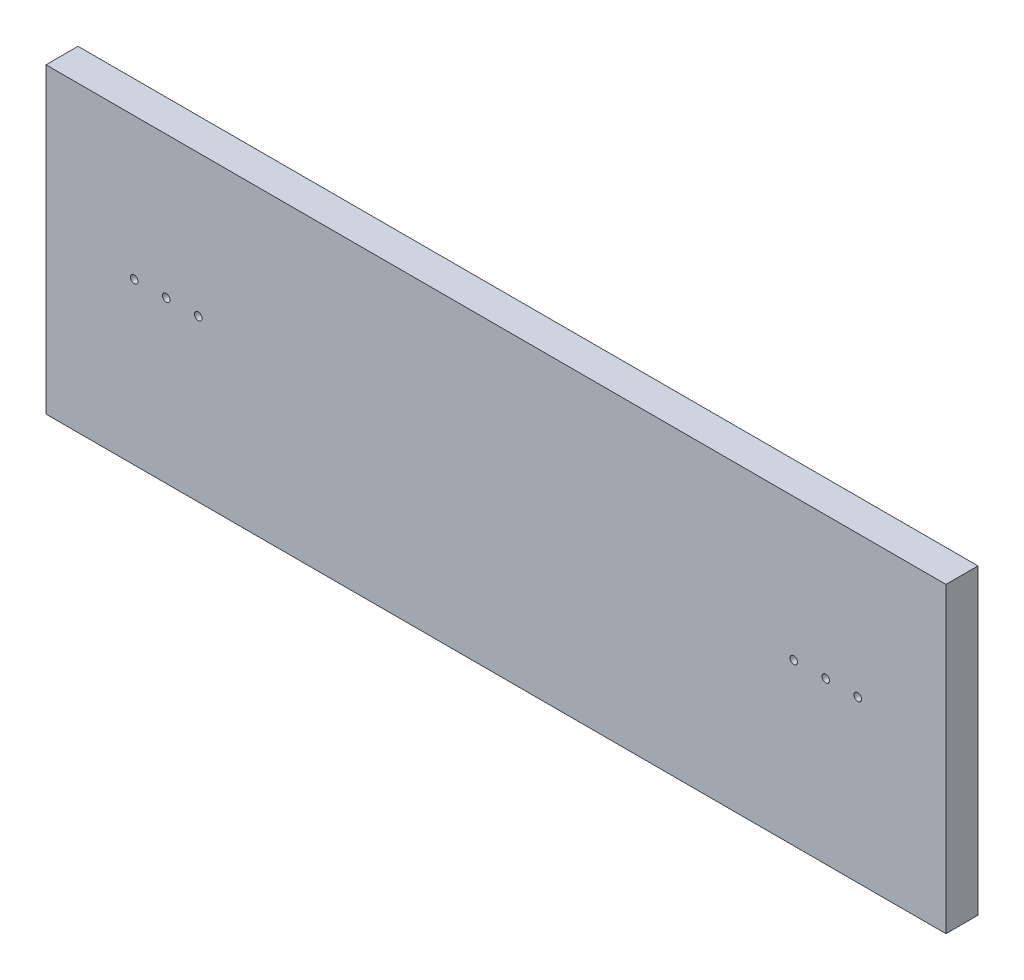
ISO-10303-21;
HEADER;
FILE_DESCRIPTION(('STEP AP214'),'2;1');
FILE_NAME('part.step','',(''),(''),'','','');
FILE_SCHEMA(('AUTOMOTIVE_DESIGN { 1 0 10303 214 1 1 1 1 }'));
ENDSEC;
DATA;
#1=APPLICATION_CONTEXT('core data for automotive mechanical design processes');
#2=APPLICATION_PROTOCOL_DEFINITION('international standard','automotive_design',2000,#1);
#3=PRODUCT_CONTEXT('',#1,'mechanical');
#4=PRODUCT('Part','Part','',(#3));
#5=PRODUCT_RELATED_PRODUCT_CATEGORY('part','',(#4));
#6=PRODUCT_DEFINITION_FORMATION('','',#4);
#7=PRODUCT_DEFINITION_CONTEXT('part definition',#1,'design');
#8=PRODUCT_DEFINITION('design','',#6,#7);
#9=PRODUCT_DEFINITION_SHAPE('','',#8);
#10=(LENGTH_UNIT() NAMED_UNIT(*) SI_UNIT(.MILLI.,.METRE.));
#11=(NAMED_UNIT(*) PLANE_ANGLE_UNIT() SI_UNIT($,.RADIAN.));
#12=(NAMED_UNIT(*) SI_UNIT($,.STERADIAN.) SOLID_ANGLE_UNIT());
#13=UNCERTAINTY_MEASURE_WITH_UNIT(LENGTH_MEASURE(1.E-05),#10,'distance_accuracy_value','');
#14=(GEOMETRIC_REPRESENTATION_CONTEXT(3) GLOBAL_UNCERTAINTY_ASSIGNED_CONTEXT((#13)) GLOBAL_UNIT_ASSIGNED_CONTEXT((#10,
#11,#12)) REPRESENTATION_CONTEXT('',''));
#15=CARTESIAN_POINT('',(0.,0.,0.));
#16=DIRECTION('',(0.,0.,1.));
#17=DIRECTION('',(1.,0.,0.));
#18=AXIS2_PLACEMENT_3D('',#15,#16,#17);
#19=CARTESIAN_POINT('',(178.5,60.,12.7));
#20=DIRECTION('',(-1.,0.,0.));
#21=DIRECTION('',(0.,0.,1.));
#22=AXIS2_PLACEMENT_3D('',#19,#20,#21);
#23=PLANE('',#22);
#24=DIRECTION('',(0.,1.,0.));
#25=VECTOR('',#24,1.);
#26=CARTESIAN_POINT('',(178.5,60.,0.));
#27=LINE('',#26,#25);
#28=CARTESIAN_POINT('',(178.5,-60.,0.));
#29=VERTEX_POINT('',#28);
#30=CARTESIAN_POINT('',(178.5,60.,0.));
#31=VERTEX_POINT('',#30);
#32=EDGE_CURVE('E106',#29,#31,#27,.T.);
#33=ORIENTED_EDGE('',*,*,#32,.T.);
#34=DIRECTION('',(0.,0.,-1.));
#35=VECTOR('',#34,1.);
#36=CARTESIAN_POINT('',(178.5,60.,12.7));
#37=LINE('',#36,#35);
#38=CARTESIAN_POINT('',(178.5,60.,12.7));
#39=VERTEX_POINT('',#38);
#40=EDGE_CURVE('E11',#39,#31,#37,.T.);
#41=ORIENTED_EDGE('',*,*,#40,.F.);
#42=DIRECTION('',(0.,1.,0.));
#43=VECTOR('',#42,1.);
#44=CARTESIAN_POINT('',(178.5,60.,12.7));
#45=LINE('',#44,#43);
#46=CARTESIAN_POINT('',(178.5,-60.,12.7));
#47=VERTEX_POINT('',#46);
#48=EDGE_CURVE('E94',#47,#39,#45,.T.);
#49=ORIENTED_EDGE('',*,*,#48,.F.);
#50=DIRECTION('',(0.,0.,-1.));
#51=VECTOR('',#50,1.);
#52=CARTESIAN_POINT('',(178.5,-60.,12.7));
#53=LINE('',#52,#51);
#54=EDGE_CURVE('E102',#47,#29,#53,.T.);
#55=ORIENTED_EDGE('',*,*,#54,.T.);
#56=EDGE_LOOP('',(#33,#41,#49,#55));
#57=FACE_BOUND('',#56,.T.);
#58=ADVANCED_FACE('F43',(#57),#23,.F.);
#59=CARTESIAN_POINT('',(-178.5,60.,12.7));
#60=DIRECTION('',(0.,-1.,0.));
#61=DIRECTION('',(0.,0.,-1.));
#62=AXIS2_PLACEMENT_3D('',#59,#60,#61);
#63=PLANE('',#62);
#64=DIRECTION('',(-1.,0.,0.));
#65=VECTOR('',#64,1.);
#66=CARTESIAN_POINT('',(-178.5,60.,0.));
#67=LINE('',#66,#65);
#68=CARTESIAN_POINT('',(-178.5,60.,0.));
#69=VERTEX_POINT('',#68);
#70=EDGE_CURVE('E98',#31,#69,#67,.T.);
#71=ORIENTED_EDGE('',*,*,#70,.T.);
#72=DIRECTION('',(0.,0.,-1.));
#73=VECTOR('',#72,1.);
#74=CARTESIAN_POINT('',(-178.5,60.,12.7));
#75=LINE('',#74,#73);
#76=CARTESIAN_POINT('',(-178.5,60.,12.7));
#77=VERTEX_POINT('',#76);
#78=EDGE_CURVE('E51',#77,#69,#75,.T.);
#79=ORIENTED_EDGE('',*,*,#78,.F.);
#80=DIRECTION('',(-1.,0.,0.));
#81=VECTOR('',#80,1.);
#82=CARTESIAN_POINT('',(-178.5,60.,12.7));
#83=LINE('',#82,#81);
#84=EDGE_CURVE('E89',#39,#77,#83,.T.);
#85=ORIENTED_EDGE('',*,*,#84,.F.);
#86=ORIENTED_EDGE('',*,*,#40,.T.);
#87=EDGE_LOOP('',(#71,#79,#85,#86));
#88=FACE_BOUND('',#87,.T.);
#89=ADVANCED_FACE('F97',(#88),#63,.F.);
#90=CARTESIAN_POINT('',(-178.5,60.,12.7));
#91=DIRECTION('',(1.,0.,0.));
#92=DIRECTION('',(0.,0.,-1.));
#93=AXIS2_PLACEMENT_3D('',#90,#91,#92);
#94=PLANE('',#93);
#95=DIRECTION('',(0.,-1.,0.));
#96=VECTOR('',#95,1.);
#97=CARTESIAN_POINT('',(-178.5,60.,0.));
#98=LINE('',#97,#96);
#99=CARTESIAN_POINT('',(-178.5,-60.,0.));
#100=VERTEX_POINT('',#99);
#101=EDGE_CURVE('E76',#69,#100,#98,.T.);
#102=ORIENTED_EDGE('',*,*,#101,.T.);
#103=DIRECTION('',(0.,0.,-1.));
#104=VECTOR('',#103,1.);
#105=CARTESIAN_POINT('',(-178.5,-60.,12.7));
#106=LINE('',#105,#104);
#107=CARTESIAN_POINT('',(-178.5,-60.,12.7));
#108=VERTEX_POINT('',#107);
#109=EDGE_CURVE('E99',#108,#100,#106,.T.);
#110=ORIENTED_EDGE('',*,*,#109,.F.);
#111=DIRECTION('',(0.,-1.,0.));
#112=VECTOR('',#111,1.);
#113=CARTESIAN_POINT('',(-178.5,60.,12.7));
#114=LINE('',#113,#112);
#115=EDGE_CURVE('E92',#77,#108,#114,.T.);
#116=ORIENTED_EDGE('',*,*,#115,.F.);
#117=ORIENTED_EDGE('',*,*,#78,.T.);
#118=EDGE_LOOP('',(#102,#110,#116,#117));
#119=FACE_BOUND('',#118,.T.);
#120=ADVANCED_FACE('F100',(#119),#94,.F.);
#121=CARTESIAN_POINT('',(-178.5,-60.,12.7));
#122=DIRECTION('',(0.,1.,0.));
#123=DIRECTION('',(0.,0.,1.));
#124=AXIS2_PLACEMENT_3D('',#121,#122,#123);
#125=PLANE('',#124);
#126=DIRECTION('',(1.,0.,0.));
#127=VECTOR('',#126,1.);
#128=CARTESIAN_POINT('',(-178.5,-60.,0.));
#129=LINE('',#128,#127);
#130=EDGE_CURVE('E82',#100,#29,#129,.T.);
#131=ORIENTED_EDGE('',*,*,#130,.T.);
#132=ORIENTED_EDGE('',*,*,#54,.F.);
#133=DIRECTION('',(1.,0.,0.));
#134=VECTOR('',#133,1.);
#135=CARTESIAN_POINT('',(-178.5,-60.,12.7));
#136=LINE('',#135,#134);
#137=EDGE_CURVE('E59',#108,#47,#136,.T.);
#138=ORIENTED_EDGE('',*,*,#137,.F.);
#139=ORIENTED_EDGE('',*,*,#109,.T.);
#140=EDGE_LOOP('',(#131,#132,#138,#139));
#141=FACE_BOUND('',#140,.T.);
#142=ADVANCED_FACE('F114',(#141),#125,.F.);
#143=CARTESIAN_POINT('',(0.,0.,12.7));
#144=DIRECTION('',(0.,0.,1.));
#145=DIRECTION('',(1.,0.,0.));
#146=AXIS2_PLACEMENT_3D('',#143,#144,#145);
#147=PLANE('',#146);
#148=CARTESIAN_POINT('',(143.5,3.80000000000007,12.7));
#149=DIRECTION('',(0.,0.,1.));
#150=DIRECTION('',(1.,0.,0.));
#151=AXIS2_PLACEMENT_3D('',#148,#149,#150);
#152=CIRCLE('',#151,1.5);
#153=CARTESIAN_POINT('',(145.,3.80000000000007,12.7));
#154=VERTEX_POINT('',#153);
#155=EDGE_CURVE('E150',#154,#154,#152,.T.);
#156=ORIENTED_EDGE('',*,*,#155,.F.);
#157=EDGE_LOOP('',(#156));
#158=FACE_BOUND('',#157,.T.);
#159=CARTESIAN_POINT('',(130.8,3.80000000000007,12.7));
#160=DIRECTION('',(0.,0.,1.));
#161=DIRECTION('',(1.,0.,0.));
#162=AXIS2_PLACEMENT_3D('',#159,#160,#161);
#163=CIRCLE('',#162,1.5);
#164=CARTESIAN_POINT('',(132.3,3.80000000000007,12.7));
#165=VERTEX_POINT('',#164);
#166=EDGE_CURVE('E147',#165,#165,#163,.T.);
#167=ORIENTED_EDGE('',*,*,#166,.F.);
#168=EDGE_LOOP('',(#167));
#169=FACE_BOUND('',#168,.T.);
#170=CARTESIAN_POINT('',(118.1,3.80000000000007,12.7));
#171=DIRECTION('',(0.,0.,1.));
#172=DIRECTION('',(1.,0.,0.));
#173=AXIS2_PLACEMENT_3D('',#170,#171,#172);
#174=CIRCLE('',#173,1.5);
#175=CARTESIAN_POINT('',(119.6,3.80000000000007,12.7));
#176=VERTEX_POINT('',#175);
#177=EDGE_CURVE('E141',#176,#176,#174,.T.);
#178=ORIENTED_EDGE('',*,*,#177,.F.);
#179=EDGE_LOOP('',(#178));
#180=FACE_BOUND('',#179,.T.);
#181=CARTESIAN_POINT('',(-118.1,3.80000000000004,12.7));
#182=DIRECTION('',(0.,0.,1.));
#183=DIRECTION('',(-1.,0.,0.));
#184=AXIS2_PLACEMENT_3D('',#181,#182,#183);
#185=CIRCLE('',#184,1.5);
#186=CARTESIAN_POINT('',(-119.6,3.80000000000004,12.7));
#187=VERTEX_POINT('',#186);
#188=EDGE_CURVE('E135',#187,#187,#185,.T.);
#189=ORIENTED_EDGE('',*,*,#188,.F.);
#190=EDGE_LOOP('',(#189));
#191=FACE_BOUND('',#190,.T.);
#192=CARTESIAN_POINT('',(-130.8,3.80000000000004,12.7));
#193=DIRECTION('',(0.,0.,1.));
#194=DIRECTION('',(-1.,0.,0.));
#195=AXIS2_PLACEMENT_3D('',#192,#193,#194);
#196=CIRCLE('',#195,1.5);
#197=CARTESIAN_POINT('',(-132.3,3.80000000000004,12.7));
#198=VERTEX_POINT('',#197);
#199=EDGE_CURVE('E129',#198,#198,#196,.T.);
#200=ORIENTED_EDGE('',*,*,#199,.F.);
#201=EDGE_LOOP('',(#200));
#202=FACE_BOUND('',#201,.T.);
#203=CARTESIAN_POINT('',(-143.5,3.80000000000004,12.7));
#204=DIRECTION('',(0.,0.,1.));
#205=DIRECTION('',(-1.,0.,0.));
#206=AXIS2_PLACEMENT_3D('',#203,#204,#205);
#207=CIRCLE('',#206,1.5);
#208=CARTESIAN_POINT('',(-145.,3.80000000000004,12.7));
#209=VERTEX_POINT('',#208);
#210=EDGE_CURVE('E123',#209,#209,#207,.T.);
#211=ORIENTED_EDGE('',*,*,#210,.F.);
#212=EDGE_LOOP('',(#211));
#213=FACE_BOUND('',#212,.T.);
#214=ORIENTED_EDGE('',*,*,#48,.T.);
#215=ORIENTED_EDGE('',*,*,#84,.T.);
#216=ORIENTED_EDGE('',*,*,#115,.T.);
#217=ORIENTED_EDGE('',*,*,#137,.T.);
#218=EDGE_LOOP('',(#214,#215,#216,#217));
#219=FACE_BOUND('',#218,.T.);
#220=ADVANCED_FACE('F90',(#158,#169,#180,#191,#202,#213,#219),#147,.T.);
#221=CARTESIAN_POINT('',(0.,0.,0.));
#222=DIRECTION('',(0.,0.,1.));
#223=DIRECTION('',(1.,0.,0.));
#224=AXIS2_PLACEMENT_3D('',#221,#222,#223);
#225=PLANE('',#224);
#226=CARTESIAN_POINT('',(143.5,3.80000000000007,0.));
#227=DIRECTION('',(0.,0.,1.));
#228=DIRECTION('',(1.,0.,0.));
#229=AXIS2_PLACEMENT_3D('',#226,#227,#228);
#230=CIRCLE('',#229,1.5);
#231=CARTESIAN_POINT('',(145.,3.80000000000007,0.));
#232=VERTEX_POINT('',#231);
#233=EDGE_CURVE('E109',#232,#232,#230,.T.);
#234=ORIENTED_EDGE('',*,*,#233,.T.);
#235=EDGE_LOOP('',(#234));
#236=FACE_BOUND('',#235,.T.);
#237=CARTESIAN_POINT('',(130.8,3.80000000000007,0.));
#238=DIRECTION('',(0.,0.,1.));
#239=DIRECTION('',(1.,0.,0.));
#240=AXIS2_PLACEMENT_3D('',#237,#238,#239);
#241=CIRCLE('',#240,1.5);
#242=CARTESIAN_POINT('',(132.3,3.80000000000007,0.));
#243=VERTEX_POINT('',#242);
#244=EDGE_CURVE('E144',#243,#243,#241,.T.);
#245=ORIENTED_EDGE('',*,*,#244,.T.);
#246=EDGE_LOOP('',(#245));
#247=FACE_BOUND('',#246,.T.);
#248=CARTESIAN_POINT('',(118.1,3.80000000000007,0.));
#249=DIRECTION('',(0.,0.,1.));
#250=DIRECTION('',(1.,0.,0.));
#251=AXIS2_PLACEMENT_3D('',#248,#249,#250);
#252=CIRCLE('',#251,1.5);
#253=CARTESIAN_POINT('',(119.6,3.80000000000007,0.));
#254=VERTEX_POINT('',#253);
#255=EDGE_CURVE('E138',#254,#254,#252,.T.);
#256=ORIENTED_EDGE('',*,*,#255,.T.);
#257=EDGE_LOOP('',(#256));
#258=FACE_BOUND('',#257,.T.);
#259=CARTESIAN_POINT('',(-118.1,3.80000000000004,0.));
#260=DIRECTION('',(0.,0.,1.));
#261=DIRECTION('',(-1.,0.,0.));
#262=AXIS2_PLACEMENT_3D('',#259,#260,#261);
#263=CIRCLE('',#262,1.5);
#264=CARTESIAN_POINT('',(-119.6,3.80000000000004,0.));
#265=VERTEX_POINT('',#264);
#266=EDGE_CURVE('E132',#265,#265,#263,.T.);
#267=ORIENTED_EDGE('',*,*,#266,.T.);
#268=EDGE_LOOP('',(#267));
#269=FACE_BOUND('',#268,.T.);
#270=CARTESIAN_POINT('',(-130.8,3.80000000000004,0.));
#271=DIRECTION('',(0.,0.,1.));
#272=DIRECTION('',(-1.,0.,0.));
#273=AXIS2_PLACEMENT_3D('',#270,#271,#272);
#274=CIRCLE('',#273,1.5);
#275=CARTESIAN_POINT('',(-132.3,3.80000000000004,0.));
#276=VERTEX_POINT('',#275);
#277=EDGE_CURVE('E126',#276,#276,#274,.T.);
#278=ORIENTED_EDGE('',*,*,#277,.T.);
#279=EDGE_LOOP('',(#278));
#280=FACE_BOUND('',#279,.T.);
#281=CARTESIAN_POINT('',(-143.5,3.80000000000004,0.));
#282=DIRECTION('',(0.,0.,1.));
#283=DIRECTION('',(-1.,0.,0.));
#284=AXIS2_PLACEMENT_3D('',#281,#282,#283);
#285=CIRCLE('',#284,1.5);
#286=CARTESIAN_POINT('',(-145.,3.80000000000004,0.));
#287=VERTEX_POINT('',#286);
#288=EDGE_CURVE('E120',#287,#287,#285,.T.);
#289=ORIENTED_EDGE('',*,*,#288,.T.);
#290=EDGE_LOOP('',(#289));
#291=FACE_BOUND('',#290,.T.);
#292=ORIENTED_EDGE('',*,*,#32,.F.);
#293=ORIENTED_EDGE('',*,*,#130,.F.);
#294=ORIENTED_EDGE('',*,*,#101,.F.);
#295=ORIENTED_EDGE('',*,*,#70,.F.);
#296=EDGE_LOOP('',(#292,#293,#294,#295));
#297=FACE_BOUND('',#296,.T.);
#298=ADVANCED_FACE('F117',(#236,#247,#258,#269,#280,#291,#297),#225,.F.);
#299=CARTESIAN_POINT('',(-143.5,3.80000000000004,0.));
#300=DIRECTION('',(0.,0.,1.));
#301=DIRECTION('',(1.,0.,0.));
#302=AXIS2_PLACEMENT_3D('',#299,#300,#301);
#303=CYLINDRICAL_SURFACE('',#302,1.5);
#304=ORIENTED_EDGE('',*,*,#288,.F.);
#305=EDGE_LOOP('',(#304));
#306=FACE_BOUND('',#305,.T.);
#307=ORIENTED_EDGE('',*,*,#210,.T.);
#308=EDGE_LOOP('',(#307));
#309=FACE_BOUND('',#308,.T.);
#310=ADVANCED_FACE('F178',(#306,#309),#303,.F.);
#311=CARTESIAN_POINT('',(-130.8,3.80000000000004,0.));
#312=DIRECTION('',(0.,0.,1.));
#313=DIRECTION('',(1.,0.,0.));
#314=AXIS2_PLACEMENT_3D('',#311,#312,#313);
#315=CYLINDRICAL_SURFACE('',#314,1.5);
#316=ORIENTED_EDGE('',*,*,#277,.F.);
#317=EDGE_LOOP('',(#316));
#318=FACE_BOUND('',#317,.T.);
#319=ORIENTED_EDGE('',*,*,#199,.T.);
#320=EDGE_LOOP('',(#319));
#321=FACE_BOUND('',#320,.T.);
#322=ADVANCED_FACE('F180',(#318,#321),#315,.F.);
#323=CARTESIAN_POINT('',(-118.1,3.80000000000004,0.));
#324=DIRECTION('',(0.,0.,1.));
#325=DIRECTION('',(1.,0.,0.));
#326=AXIS2_PLACEMENT_3D('',#323,#324,#325);
#327=CYLINDRICAL_SURFACE('',#326,1.5);
#328=ORIENTED_EDGE('',*,*,#266,.F.);
#329=EDGE_LOOP('',(#328));
#330=FACE_BOUND('',#329,.T.);
#331=ORIENTED_EDGE('',*,*,#188,.T.);
#332=EDGE_LOOP('',(#331));
#333=FACE_BOUND('',#332,.T.);
#334=ADVANCED_FACE('F187',(#330,#333),#327,.F.);
#335=CARTESIAN_POINT('',(118.1,3.80000000000007,0.));
#336=DIRECTION('',(0.,0.,1.));
#337=DIRECTION('',(1.,0.,0.));
#338=AXIS2_PLACEMENT_3D('',#335,#336,#337);
#339=CYLINDRICAL_SURFACE('',#338,1.5);
#340=ORIENTED_EDGE('',*,*,#255,.F.);
#341=EDGE_LOOP('',(#340));
#342=FACE_BOUND('',#341,.T.);
#343=ORIENTED_EDGE('',*,*,#177,.T.);
#344=EDGE_LOOP('',(#343));
#345=FACE_BOUND('',#344,.T.);
#346=ADVANCED_FACE('F236',(#342,#345),#339,.F.);
#347=CARTESIAN_POINT('',(130.8,3.80000000000007,0.));
#348=DIRECTION('',(0.,0.,1.));
#349=DIRECTION('',(1.,0.,0.));
#350=AXIS2_PLACEMENT_3D('',#347,#348,#349);
#351=CYLINDRICAL_SURFACE('',#350,1.5);
#352=ORIENTED_EDGE('',*,*,#244,.F.);
#353=EDGE_LOOP('',(#352));
#354=FACE_BOUND('',#353,.T.);
#355=ORIENTED_EDGE('',*,*,#166,.T.);
#356=EDGE_LOOP('',(#355));
#357=FACE_BOUND('',#356,.T.);
#358=ADVANCED_FACE('F161',(#354,#357),#351,.F.);
#359=CARTESIAN_POINT('',(143.5,3.80000000000007,0.));
#360=DIRECTION('',(0.,0.,1.));
#361=DIRECTION('',(1.,0.,0.));
#362=AXIS2_PLACEMENT_3D('',#359,#360,#361);
#363=CYLINDRICAL_SURFACE('',#362,1.5);
#364=ORIENTED_EDGE('',*,*,#233,.F.);
#365=EDGE_LOOP('',(#364));
#366=FACE_BOUND('',#365,.T.);
#367=ORIENTED_EDGE('',*,*,#155,.T.);
#368=EDGE_LOOP('',(#367));
#369=FACE_BOUND('',#368,.T.);
#370=ADVANCED_FACE('F158',(#366,#369),#363,.F.);
#371=CLOSED_SHELL('',(#58,#89,#120,#142,#220,#298,#310,#322,#334,#346,#358,#370));
#372=MANIFOLD_SOLID_BREP('B2',#371);
#373=ADVANCED_BREP_SHAPE_REPRESENTATION('',(#18,#372),#14);
#374=SHAPE_DEFINITION_REPRESENTATION(#9,#373);
ENDSEC;
END-ISO-10303-21;
